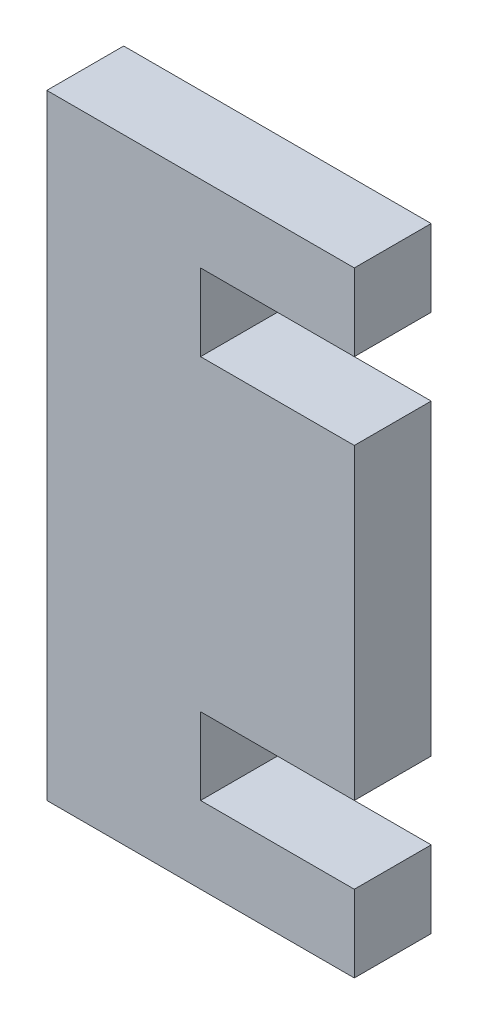
ISO-10303-21;
HEADER;
FILE_DESCRIPTION(('STEP AP214'),'2;1');
FILE_NAME('part.step','',(''),(''),'','','');
FILE_SCHEMA(('AUTOMOTIVE_DESIGN { 1 0 10303 214 1 1 1 1 }'));
ENDSEC;
DATA;
#1=APPLICATION_CONTEXT('core data for automotive mechanical design processes');
#2=APPLICATION_PROTOCOL_DEFINITION('international standard','automotive_design',2000,#1);
#3=PRODUCT_CONTEXT('',#1,'mechanical');
#4=PRODUCT('Part','Part','',(#3));
#5=PRODUCT_RELATED_PRODUCT_CATEGORY('part','',(#4));
#6=PRODUCT_DEFINITION_FORMATION('','',#4);
#7=PRODUCT_DEFINITION_CONTEXT('part definition',#1,'design');
#8=PRODUCT_DEFINITION('design','',#6,#7);
#9=PRODUCT_DEFINITION_SHAPE('','',#8);
#10=(LENGTH_UNIT() NAMED_UNIT(*) SI_UNIT(.MILLI.,.METRE.));
#11=(NAMED_UNIT(*) PLANE_ANGLE_UNIT() SI_UNIT($,.RADIAN.));
#12=(NAMED_UNIT(*) SI_UNIT($,.STERADIAN.) SOLID_ANGLE_UNIT());
#13=UNCERTAINTY_MEASURE_WITH_UNIT(LENGTH_MEASURE(1.E-05),#10,'distance_accuracy_value','');
#14=(GEOMETRIC_REPRESENTATION_CONTEXT(3) GLOBAL_UNCERTAINTY_ASSIGNED_CONTEXT((#13)) GLOBAL_UNIT_ASSIGNED_CONTEXT((#10,
#11,#12)) REPRESENTATION_CONTEXT('',''));
#15=CARTESIAN_POINT('',(0.,0.,0.));
#16=DIRECTION('',(0.,0.,1.));
#17=DIRECTION('',(1.,0.,0.));
#18=AXIS2_PLACEMENT_3D('',#15,#16,#17);
#19=CARTESIAN_POINT('',(0.,0.,5.));
#20=DIRECTION('',(1.,0.,0.));
#21=DIRECTION('',(0.,1.,0.));
#22=AXIS2_PLACEMENT_3D('',#19,#20,#21);
#23=PLANE('',#22);
#24=DIRECTION('',(0.,-1.,0.));
#25=VECTOR('',#24,1.);
#26=CARTESIAN_POINT('',(0.,0.,0.));
#27=LINE('',#26,#25);
#28=CARTESIAN_POINT('',(0.,0.,0.));
#29=VERTEX_POINT('',#28);
#30=CARTESIAN_POINT('',(0.,-40.,0.));
#31=VERTEX_POINT('',#30);
#32=EDGE_CURVE('E152',#29,#31,#27,.T.);
#33=ORIENTED_EDGE('',*,*,#32,.T.);
#34=DIRECTION('',(0.,0.,-1.));
#35=VECTOR('',#34,1.);
#36=CARTESIAN_POINT('',(0.,-40.,5.));
#37=LINE('',#36,#35);
#38=CARTESIAN_POINT('',(0.,-40.,5.));
#39=VERTEX_POINT('',#38);
#40=EDGE_CURVE('E11',#39,#31,#37,.T.);
#41=ORIENTED_EDGE('',*,*,#40,.F.);
#42=DIRECTION('',(0.,-1.,0.));
#43=VECTOR('',#42,1.);
#44=CARTESIAN_POINT('',(0.,0.,5.));
#45=LINE('',#44,#43);
#46=CARTESIAN_POINT('',(0.,0.,5.));
#47=VERTEX_POINT('',#46);
#48=EDGE_CURVE('E174',#47,#39,#45,.T.);
#49=ORIENTED_EDGE('',*,*,#48,.F.);
#50=DIRECTION('',(0.,0.,-1.));
#51=VECTOR('',#50,1.);
#52=CARTESIAN_POINT('',(0.,0.,5.));
#53=LINE('',#52,#51);
#54=EDGE_CURVE('E148',#47,#29,#53,.T.);
#55=ORIENTED_EDGE('',*,*,#54,.T.);
#56=EDGE_LOOP('',(#33,#41,#49,#55));
#57=FACE_BOUND('',#56,.T.);
#58=ADVANCED_FACE('F32',(#57),#23,.F.);
#59=CARTESIAN_POINT('',(0.,-40.,5.));
#60=DIRECTION('',(0.,1.,0.));
#61=DIRECTION('',(0.,0.,1.));
#62=AXIS2_PLACEMENT_3D('',#59,#60,#61);
#63=PLANE('',#62);
#64=DIRECTION('',(1.,0.,0.));
#65=VECTOR('',#64,1.);
#66=CARTESIAN_POINT('',(0.,-40.,0.));
#67=LINE('',#66,#65);
#68=CARTESIAN_POINT('',(20.,-40.,0.));
#69=VERTEX_POINT('',#68);
#70=EDGE_CURVE('E155',#31,#69,#67,.T.);
#71=ORIENTED_EDGE('',*,*,#70,.T.);
#72=DIRECTION('',(0.,0.,-1.));
#73=VECTOR('',#72,1.);
#74=CARTESIAN_POINT('',(20.,-40.,5.));
#75=LINE('',#74,#73);
#76=CARTESIAN_POINT('',(20.,-40.,5.));
#77=VERTEX_POINT('',#76);
#78=EDGE_CURVE('E40',#77,#69,#75,.T.);
#79=ORIENTED_EDGE('',*,*,#78,.F.);
#80=DIRECTION('',(1.,0.,0.));
#81=VECTOR('',#80,1.);
#82=CARTESIAN_POINT('',(0.,-40.,5.));
#83=LINE('',#82,#81);
#84=EDGE_CURVE('E103',#39,#77,#83,.T.);
#85=ORIENTED_EDGE('',*,*,#84,.F.);
#86=ORIENTED_EDGE('',*,*,#40,.T.);
#87=EDGE_LOOP('',(#71,#79,#85,#86));
#88=FACE_BOUND('',#87,.T.);
#89=ADVANCED_FACE('F252',(#88),#63,.F.);
#90=CARTESIAN_POINT('',(20.,-35.,5.));
#91=DIRECTION('',(-1.,0.,0.));
#92=DIRECTION('',(0.,0.,1.));
#93=AXIS2_PLACEMENT_3D('',#90,#91,#92);
#94=PLANE('',#93);
#95=DIRECTION('',(0.,1.,0.));
#96=VECTOR('',#95,1.);
#97=CARTESIAN_POINT('',(20.,-35.,0.));
#98=LINE('',#97,#96);
#99=CARTESIAN_POINT('',(20.,-35.,0.));
#100=VERTEX_POINT('',#99);
#101=EDGE_CURVE('E157',#69,#100,#98,.T.);
#102=ORIENTED_EDGE('',*,*,#101,.T.);
#103=DIRECTION('',(0.,0.,-1.));
#104=VECTOR('',#103,1.);
#105=CARTESIAN_POINT('',(20.,-35.,5.));
#106=LINE('',#105,#104);
#107=CARTESIAN_POINT('',(20.,-35.,5.));
#108=VERTEX_POINT('',#107);
#109=EDGE_CURVE('E193',#108,#100,#106,.T.);
#110=ORIENTED_EDGE('',*,*,#109,.F.);
#111=DIRECTION('',(0.,1.,0.));
#112=VECTOR('',#111,1.);
#113=CARTESIAN_POINT('',(20.,-35.,5.));
#114=LINE('',#113,#112);
#115=EDGE_CURVE('E201',#77,#108,#114,.T.);
#116=ORIENTED_EDGE('',*,*,#115,.F.);
#117=ORIENTED_EDGE('',*,*,#78,.T.);
#118=EDGE_LOOP('',(#102,#110,#116,#117));
#119=FACE_BOUND('',#118,.T.);
#120=ADVANCED_FACE('F199',(#119),#94,.F.);
#121=CARTESIAN_POINT('',(20.,-35.,5.));
#122=DIRECTION('',(0.,-1.,0.));
#123=DIRECTION('',(0.,0.,-1.));
#124=AXIS2_PLACEMENT_3D('',#121,#122,#123);
#125=PLANE('',#124);
#126=DIRECTION('',(-1.,0.,0.));
#127=VECTOR('',#126,1.);
#128=CARTESIAN_POINT('',(20.,-35.,0.));
#129=LINE('',#128,#127);
#130=CARTESIAN_POINT('',(10.,-35.,0.));
#131=VERTEX_POINT('',#130);
#132=EDGE_CURVE('E159',#100,#131,#129,.T.);
#133=ORIENTED_EDGE('',*,*,#132,.T.);
#134=DIRECTION('',(0.,0.,-1.));
#135=VECTOR('',#134,1.);
#136=CARTESIAN_POINT('',(10.,-35.,5.));
#137=LINE('',#136,#135);
#138=CARTESIAN_POINT('',(10.,-35.,5.));
#139=VERTEX_POINT('',#138);
#140=EDGE_CURVE('E190',#139,#131,#137,.T.);
#141=ORIENTED_EDGE('',*,*,#140,.F.);
#142=DIRECTION('',(-1.,0.,0.));
#143=VECTOR('',#142,1.);
#144=CARTESIAN_POINT('',(20.,-35.,5.));
#145=LINE('',#144,#143);
#146=EDGE_CURVE('E219',#108,#139,#145,.T.);
#147=ORIENTED_EDGE('',*,*,#146,.F.);
#148=ORIENTED_EDGE('',*,*,#109,.T.);
#149=EDGE_LOOP('',(#133,#141,#147,#148));
#150=FACE_BOUND('',#149,.T.);
#151=ADVANCED_FACE('F210',(#150),#125,.F.);
#152=CARTESIAN_POINT('',(10.,-35.,5.));
#153=DIRECTION('',(-1.,0.,0.));
#154=DIRECTION('',(0.,0.,1.));
#155=AXIS2_PLACEMENT_3D('',#152,#153,#154);
#156=PLANE('',#155);
#157=DIRECTION('',(0.,1.,0.));
#158=VECTOR('',#157,1.);
#159=CARTESIAN_POINT('',(10.,-35.,0.));
#160=LINE('',#159,#158);
#161=CARTESIAN_POINT('',(10.,-30.,0.));
#162=VERTEX_POINT('',#161);
#163=EDGE_CURVE('E161',#131,#162,#160,.T.);
#164=ORIENTED_EDGE('',*,*,#163,.T.);
#165=DIRECTION('',(0.,0.,-1.));
#166=VECTOR('',#165,1.);
#167=CARTESIAN_POINT('',(10.,-30.,5.));
#168=LINE('',#167,#166);
#169=CARTESIAN_POINT('',(10.,-30.,5.));
#170=VERTEX_POINT('',#169);
#171=EDGE_CURVE('E187',#170,#162,#168,.T.);
#172=ORIENTED_EDGE('',*,*,#171,.F.);
#173=DIRECTION('',(0.,1.,0.));
#174=VECTOR('',#173,1.);
#175=CARTESIAN_POINT('',(10.,-35.,5.));
#176=LINE('',#175,#174);
#177=EDGE_CURVE('E216',#139,#170,#176,.T.);
#178=ORIENTED_EDGE('',*,*,#177,.F.);
#179=ORIENTED_EDGE('',*,*,#140,.T.);
#180=EDGE_LOOP('',(#164,#172,#178,#179));
#181=FACE_BOUND('',#180,.T.);
#182=ADVANCED_FACE('F214',(#181),#156,.F.);
#183=CARTESIAN_POINT('',(20.,-30.,5.));
#184=DIRECTION('',(0.,1.,0.));
#185=DIRECTION('',(-1.,0.,0.));
#186=AXIS2_PLACEMENT_3D('',#183,#184,#185);
#187=PLANE('',#186);
#188=DIRECTION('',(1.,0.,0.));
#189=VECTOR('',#188,1.);
#190=CARTESIAN_POINT('',(20.,-30.,0.));
#191=LINE('',#190,#189);
#192=CARTESIAN_POINT('',(20.,-30.,0.));
#193=VERTEX_POINT('',#192);
#194=EDGE_CURVE('E163',#162,#193,#191,.T.);
#195=ORIENTED_EDGE('',*,*,#194,.T.);
#196=DIRECTION('',(0.,0.,-1.));
#197=VECTOR('',#196,1.);
#198=CARTESIAN_POINT('',(20.,-30.,5.));
#199=LINE('',#198,#197);
#200=CARTESIAN_POINT('',(20.,-30.,5.));
#201=VERTEX_POINT('',#200);
#202=EDGE_CURVE('E184',#201,#193,#199,.T.);
#203=ORIENTED_EDGE('',*,*,#202,.F.);
#204=DIRECTION('',(1.,0.,0.));
#205=VECTOR('',#204,1.);
#206=CARTESIAN_POINT('',(20.,-30.,5.));
#207=LINE('',#206,#205);
#208=EDGE_CURVE('E218',#170,#201,#207,.T.);
#209=ORIENTED_EDGE('',*,*,#208,.F.);
#210=ORIENTED_EDGE('',*,*,#171,.T.);
#211=EDGE_LOOP('',(#195,#203,#209,#210));
#212=FACE_BOUND('',#211,.T.);
#213=ADVANCED_FACE('F265',(#212),#187,.F.);
#214=CARTESIAN_POINT('',(20.,-10.,5.));
#215=DIRECTION('',(-1.,0.,0.));
#216=DIRECTION('',(0.,-1.,0.));
#217=AXIS2_PLACEMENT_3D('',#214,#215,#216);
#218=PLANE('',#217);
#219=DIRECTION('',(0.,1.,0.));
#220=VECTOR('',#219,1.);
#221=CARTESIAN_POINT('',(20.,-10.,0.));
#222=LINE('',#221,#220);
#223=CARTESIAN_POINT('',(20.,-10.,0.));
#224=VERTEX_POINT('',#223);
#225=EDGE_CURVE('E165',#193,#224,#222,.T.);
#226=ORIENTED_EDGE('',*,*,#225,.T.);
#227=DIRECTION('',(0.,0.,-1.));
#228=VECTOR('',#227,1.);
#229=CARTESIAN_POINT('',(20.,-10.,5.));
#230=LINE('',#229,#228);
#231=CARTESIAN_POINT('',(20.,-10.,5.));
#232=VERTEX_POINT('',#231);
#233=EDGE_CURVE('E181',#232,#224,#230,.T.);
#234=ORIENTED_EDGE('',*,*,#233,.F.);
#235=DIRECTION('',(0.,1.,0.));
#236=VECTOR('',#235,1.);
#237=CARTESIAN_POINT('',(20.,-10.,5.));
#238=LINE('',#237,#236);
#239=EDGE_CURVE('E221',#201,#232,#238,.T.);
#240=ORIENTED_EDGE('',*,*,#239,.F.);
#241=ORIENTED_EDGE('',*,*,#202,.T.);
#242=EDGE_LOOP('',(#226,#234,#240,#241));
#243=FACE_BOUND('',#242,.T.);
#244=ADVANCED_FACE('F268',(#243),#218,.F.);
#245=CARTESIAN_POINT('',(20.,-10.,5.));
#246=DIRECTION('',(0.,-1.,0.));
#247=DIRECTION('',(1.,0.,0.));
#248=AXIS2_PLACEMENT_3D('',#245,#246,#247);
#249=PLANE('',#248);
#250=DIRECTION('',(-1.,0.,0.));
#251=VECTOR('',#250,1.);
#252=CARTESIAN_POINT('',(20.,-10.,0.));
#253=LINE('',#252,#251);
#254=CARTESIAN_POINT('',(10.,-10.,0.));
#255=VERTEX_POINT('',#254);
#256=EDGE_CURVE('E167',#224,#255,#253,.T.);
#257=ORIENTED_EDGE('',*,*,#256,.T.);
#258=DIRECTION('',(0.,0.,-1.));
#259=VECTOR('',#258,1.);
#260=CARTESIAN_POINT('',(10.,-10.,5.));
#261=LINE('',#260,#259);
#262=CARTESIAN_POINT('',(10.,-10.,5.));
#263=VERTEX_POINT('',#262);
#264=EDGE_CURVE('E178',#263,#255,#261,.T.);
#265=ORIENTED_EDGE('',*,*,#264,.F.);
#266=DIRECTION('',(-1.,0.,0.));
#267=VECTOR('',#266,1.);
#268=CARTESIAN_POINT('',(20.,-10.,5.));
#269=LINE('',#268,#267);
#270=EDGE_CURVE('E227',#232,#263,#269,.T.);
#271=ORIENTED_EDGE('',*,*,#270,.F.);
#272=ORIENTED_EDGE('',*,*,#233,.T.);
#273=EDGE_LOOP('',(#257,#265,#271,#272));
#274=FACE_BOUND('',#273,.T.);
#275=ADVANCED_FACE('F233',(#274),#249,.F.);
#276=CARTESIAN_POINT('',(10.,-5.,5.));
#277=DIRECTION('',(-1.,0.,0.));
#278=DIRECTION('',(0.,-1.,0.));
#279=AXIS2_PLACEMENT_3D('',#276,#277,#278);
#280=PLANE('',#279);
#281=DIRECTION('',(0.,1.,0.));
#282=VECTOR('',#281,1.);
#283=CARTESIAN_POINT('',(10.,-5.,0.));
#284=LINE('',#283,#282);
#285=CARTESIAN_POINT('',(10.,-5.,0.));
#286=VERTEX_POINT('',#285);
#287=EDGE_CURVE('E169',#255,#286,#284,.T.);
#288=ORIENTED_EDGE('',*,*,#287,.T.);
#289=DIRECTION('',(0.,0.,-1.));
#290=VECTOR('',#289,1.);
#291=CARTESIAN_POINT('',(10.,-5.,5.));
#292=LINE('',#291,#290);
#293=CARTESIAN_POINT('',(10.,-5.,5.));
#294=VERTEX_POINT('',#293);
#295=EDGE_CURVE('E143',#294,#286,#292,.T.);
#296=ORIENTED_EDGE('',*,*,#295,.F.);
#297=DIRECTION('',(0.,1.,0.));
#298=VECTOR('',#297,1.);
#299=CARTESIAN_POINT('',(10.,-5.,5.));
#300=LINE('',#299,#298);
#301=EDGE_CURVE('E134',#263,#294,#300,.T.);
#302=ORIENTED_EDGE('',*,*,#301,.F.);
#303=ORIENTED_EDGE('',*,*,#264,.T.);
#304=EDGE_LOOP('',(#288,#296,#302,#303));
#305=FACE_BOUND('',#304,.T.);
#306=ADVANCED_FACE('F237',(#305),#280,.F.);
#307=CARTESIAN_POINT('',(20.,-5.,5.));
#308=DIRECTION('',(0.,1.,0.));
#309=DIRECTION('',(0.,0.,1.));
#310=AXIS2_PLACEMENT_3D('',#307,#308,#309);
#311=PLANE('',#310);
#312=DIRECTION('',(1.,0.,0.));
#313=VECTOR('',#312,1.);
#314=CARTESIAN_POINT('',(20.,-5.,0.));
#315=LINE('',#314,#313);
#316=CARTESIAN_POINT('',(20.,-5.,0.));
#317=VERTEX_POINT('',#316);
#318=EDGE_CURVE('E142',#286,#317,#315,.T.);
#319=ORIENTED_EDGE('',*,*,#318,.T.);
#320=DIRECTION('',(0.,0.,-1.));
#321=VECTOR('',#320,1.);
#322=CARTESIAN_POINT('',(20.,-5.,5.));
#323=LINE('',#322,#321);
#324=CARTESIAN_POINT('',(20.,-5.,5.));
#325=VERTEX_POINT('',#324);
#326=EDGE_CURVE('E139',#325,#317,#323,.T.);
#327=ORIENTED_EDGE('',*,*,#326,.F.);
#328=DIRECTION('',(1.,0.,0.));
#329=VECTOR('',#328,1.);
#330=CARTESIAN_POINT('',(20.,-5.,5.));
#331=LINE('',#330,#329);
#332=EDGE_CURVE('E128',#294,#325,#331,.T.);
#333=ORIENTED_EDGE('',*,*,#332,.F.);
#334=ORIENTED_EDGE('',*,*,#295,.T.);
#335=EDGE_LOOP('',(#319,#327,#333,#334));
#336=FACE_BOUND('',#335,.T.);
#337=ADVANCED_FACE('F140',(#336),#311,.F.);
#338=CARTESIAN_POINT('',(20.,0.,5.));
#339=DIRECTION('',(-1.,0.,0.));
#340=DIRECTION('',(0.,0.,1.));
#341=AXIS2_PLACEMENT_3D('',#338,#339,#340);
#342=PLANE('',#341);
#343=DIRECTION('',(0.,1.,0.));
#344=VECTOR('',#343,1.);
#345=CARTESIAN_POINT('',(20.,0.,0.));
#346=LINE('',#345,#344);
#347=CARTESIAN_POINT('',(20.,0.,0.));
#348=VERTEX_POINT('',#347);
#349=EDGE_CURVE('E89',#317,#348,#346,.T.);
#350=ORIENTED_EDGE('',*,*,#349,.T.);
#351=DIRECTION('',(0.,0.,-1.));
#352=VECTOR('',#351,1.);
#353=CARTESIAN_POINT('',(20.,0.,5.));
#354=LINE('',#353,#352);
#355=CARTESIAN_POINT('',(20.,0.,5.));
#356=VERTEX_POINT('',#355);
#357=EDGE_CURVE('E144',#356,#348,#354,.T.);
#358=ORIENTED_EDGE('',*,*,#357,.F.);
#359=DIRECTION('',(0.,1.,0.));
#360=VECTOR('',#359,1.);
#361=CARTESIAN_POINT('',(20.,0.,5.));
#362=LINE('',#361,#360);
#363=EDGE_CURVE('E132',#325,#356,#362,.T.);
#364=ORIENTED_EDGE('',*,*,#363,.F.);
#365=ORIENTED_EDGE('',*,*,#326,.T.);
#366=EDGE_LOOP('',(#350,#358,#364,#365));
#367=FACE_BOUND('',#366,.T.);
#368=ADVANCED_FACE('F146',(#367),#342,.F.);
#369=CARTESIAN_POINT('',(0.,0.,5.));
#370=DIRECTION('',(0.,-1.,0.));
#371=DIRECTION('',(0.,0.,-1.));
#372=AXIS2_PLACEMENT_3D('',#369,#370,#371);
#373=PLANE('',#372);
#374=DIRECTION('',(-1.,0.,0.));
#375=VECTOR('',#374,1.);
#376=CARTESIAN_POINT('',(0.,0.,0.));
#377=LINE('',#376,#375);
#378=EDGE_CURVE('E95',#348,#29,#377,.T.);
#379=ORIENTED_EDGE('',*,*,#378,.T.);
#380=ORIENTED_EDGE('',*,*,#54,.F.);
#381=DIRECTION('',(-1.,0.,0.));
#382=VECTOR('',#381,1.);
#383=CARTESIAN_POINT('',(0.,0.,5.));
#384=LINE('',#383,#382);
#385=EDGE_CURVE('E48',#356,#47,#384,.T.);
#386=ORIENTED_EDGE('',*,*,#385,.F.);
#387=ORIENTED_EDGE('',*,*,#357,.T.);
#388=EDGE_LOOP('',(#379,#380,#386,#387));
#389=FACE_BOUND('',#388,.T.);
#390=ADVANCED_FACE('F241',(#389),#373,.F.);
#391=CARTESIAN_POINT('',(0.,0.,5.));
#392=DIRECTION('',(0.,0.,1.));
#393=DIRECTION('',(1.,0.,0.));
#394=AXIS2_PLACEMENT_3D('',#391,#392,#393);
#395=PLANE('',#394);
#396=ORIENTED_EDGE('',*,*,#48,.T.);
#397=ORIENTED_EDGE('',*,*,#84,.T.);
#398=ORIENTED_EDGE('',*,*,#115,.T.);
#399=ORIENTED_EDGE('',*,*,#146,.T.);
#400=ORIENTED_EDGE('',*,*,#177,.T.);
#401=ORIENTED_EDGE('',*,*,#208,.T.);
#402=ORIENTED_EDGE('',*,*,#239,.T.);
#403=ORIENTED_EDGE('',*,*,#270,.T.);
#404=ORIENTED_EDGE('',*,*,#301,.T.);
#405=ORIENTED_EDGE('',*,*,#332,.T.);
#406=ORIENTED_EDGE('',*,*,#363,.T.);
#407=ORIENTED_EDGE('',*,*,#385,.T.);
#408=EDGE_LOOP('',(#396,#397,#398,#399,#400,#401,#402,#403,#404,#405,#406,#407));
#409=FACE_BOUND('',#408,.T.);
#410=ADVANCED_FACE('F130',(#409),#395,.T.);
#411=CARTESIAN_POINT('',(0.,0.,0.));
#412=DIRECTION('',(0.,0.,1.));
#413=DIRECTION('',(1.,0.,0.));
#414=AXIS2_PLACEMENT_3D('',#411,#412,#413);
#415=PLANE('',#414);
#416=ORIENTED_EDGE('',*,*,#32,.F.);
#417=ORIENTED_EDGE('',*,*,#378,.F.);
#418=ORIENTED_EDGE('',*,*,#349,.F.);
#419=ORIENTED_EDGE('',*,*,#318,.F.);
#420=ORIENTED_EDGE('',*,*,#287,.F.);
#421=ORIENTED_EDGE('',*,*,#256,.F.);
#422=ORIENTED_EDGE('',*,*,#225,.F.);
#423=ORIENTED_EDGE('',*,*,#194,.F.);
#424=ORIENTED_EDGE('',*,*,#163,.F.);
#425=ORIENTED_EDGE('',*,*,#132,.F.);
#426=ORIENTED_EDGE('',*,*,#101,.F.);
#427=ORIENTED_EDGE('',*,*,#70,.F.);
#428=EDGE_LOOP('',(#416,#417,#418,#419,#420,#421,#422,#423,#424,#425,#426,#427));
#429=FACE_BOUND('',#428,.T.);
#430=ADVANCED_FACE('F205',(#429),#415,.F.);
#431=CLOSED_SHELL('',(#58,#89,#120,#151,#182,#213,#244,#275,#306,#337,#368,#390,#410,#430));
#432=MANIFOLD_SOLID_BREP('B2',#431);
#433=ADVANCED_BREP_SHAPE_REPRESENTATION('',(#18,#432),#14);
#434=SHAPE_DEFINITION_REPRESENTATION(#9,#433);
ENDSEC;
END-ISO-10303-21;
